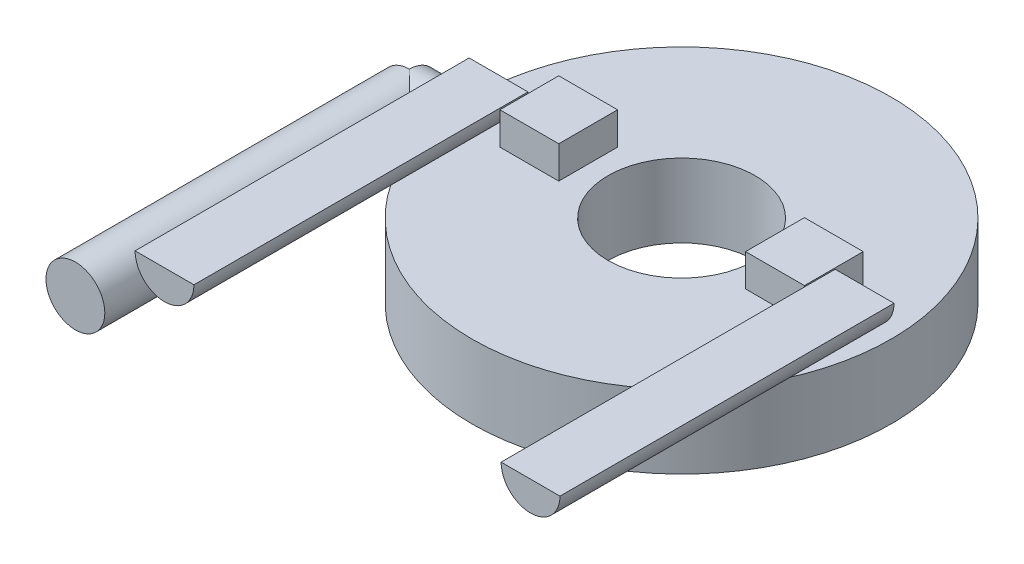
ISO-10303-21;
HEADER;
FILE_DESCRIPTION(('STEP AP214'),'2;1');
FILE_NAME('part.step','',(''),(''),'','','');
FILE_SCHEMA(('AUTOMOTIVE_DESIGN { 1 0 10303 214 1 1 1 1 }'));
ENDSEC;
DATA;
#1=APPLICATION_CONTEXT('core data for automotive mechanical design processes');
#2=APPLICATION_PROTOCOL_DEFINITION('international standard','automotive_design',2000,#1);
#3=PRODUCT_CONTEXT('',#1,'mechanical');
#4=PRODUCT('Part','Part','',(#3));
#5=PRODUCT_RELATED_PRODUCT_CATEGORY('part','',(#4));
#6=PRODUCT_DEFINITION_FORMATION('','',#4);
#7=PRODUCT_DEFINITION_CONTEXT('part definition',#1,'design');
#8=PRODUCT_DEFINITION('design','',#6,#7);
#9=PRODUCT_DEFINITION_SHAPE('','',#8);
#10=(LENGTH_UNIT() NAMED_UNIT(*) SI_UNIT(.MILLI.,.METRE.));
#11=(NAMED_UNIT(*) PLANE_ANGLE_UNIT() SI_UNIT($,.RADIAN.));
#12=(NAMED_UNIT(*) SI_UNIT($,.STERADIAN.) SOLID_ANGLE_UNIT());
#13=UNCERTAINTY_MEASURE_WITH_UNIT(LENGTH_MEASURE(1.E-05),#10,'distance_accuracy_value','');
#14=(GEOMETRIC_REPRESENTATION_CONTEXT(3) GLOBAL_UNCERTAINTY_ASSIGNED_CONTEXT((#13)) GLOBAL_UNIT_ASSIGNED_CONTEXT((#10,
#11,#12)) REPRESENTATION_CONTEXT('',''));
#15=CARTESIAN_POINT('',(0.,0.,0.));
#16=DIRECTION('',(0.,0.,1.));
#17=DIRECTION('',(1.,0.,0.));
#18=AXIS2_PLACEMENT_3D('',#15,#16,#17);
#19=CARTESIAN_POINT('',(-18.5,2.51700154936284,60.));
#20=DIRECTION('',(0.,0.,-1.));
#21=DIRECTION('',(-1.,0.,0.));
#22=AXIS2_PLACEMENT_3D('',#19,#20,#21);
#23=CYLINDRICAL_SURFACE('',#22,2.);
#24=CARTESIAN_POINT('',(-18.5,2.51700154936284,0.));
#25=DIRECTION('',(0.707106781186547,0.,-0.707106781186547));
#26=DIRECTION('',(0.707106781186547,0.,0.707106781186547));
#27=AXIS2_PLACEMENT_3D('',#24,#25,#26);
#28=ELLIPSE('',#27,2.82842712474619,2.);
#29=CARTESIAN_POINT('',(-18.5,4.51700154936283,0.));
#30=VERTEX_POINT('',#29);
#31=CARTESIAN_POINT('',(-18.5,0.517001549362833,0.));
#32=VERTEX_POINT('',#31);
#33=EDGE_CURVE('E63',#30,#32,#28,.T.);
#34=ORIENTED_EDGE('',*,*,#33,.F.);
#35=CARTESIAN_POINT('',(-18.5,2.51700154936284,0.));
#36=DIRECTION('',(0.,0.,1.));
#37=DIRECTION('',(1.,0.,0.));
#38=AXIS2_PLACEMENT_3D('',#35,#36,#37);
#39=CIRCLE('',#38,2.);
#40=EDGE_CURVE('E67',#30,#32,#39,.T.);
#41=ORIENTED_EDGE('',*,*,#40,.T.);
#42=EDGE_LOOP('',(#34,#41));
#43=FACE_BOUND('',#42,.T.);
#44=CARTESIAN_POINT('',(-18.5,2.51700154936284,22.71));
#45=DIRECTION('',(0.,0.,1.));
#46=DIRECTION('',(1.,0.,0.));
#47=AXIS2_PLACEMENT_3D('',#44,#45,#46);
#48=CIRCLE('',#47,2.);
#49=CARTESIAN_POINT('',(-16.5,2.51700154936284,22.71));
#50=VERTEX_POINT('',#49);
#51=EDGE_CURVE('E46',#50,#50,#48,.T.);
#52=ORIENTED_EDGE('',*,*,#51,.F.);
#53=EDGE_LOOP('',(#52));
#54=FACE_BOUND('',#53,.T.);
#55=ADVANCED_FACE('F42',(#43,#54),#23,.T.);
#56=CARTESIAN_POINT('',(-18.5,2.51700154936284,0.));
#57=DIRECTION('',(1.,0.,0.));
#58=DIRECTION('',(0.,0.,-1.));
#59=AXIS2_PLACEMENT_3D('',#56,#57,#58);
#60=CYLINDRICAL_SURFACE('',#59,2.);
#61=CARTESIAN_POINT('',(-14.5,2.51700154936284,0.));
#62=DIRECTION('',(1.,0.,0.));
#63=DIRECTION('',(0.,0.,-1.));
#64=AXIS2_PLACEMENT_3D('',#61,#62,#63);
#65=CIRCLE('',#64,2.);
#66=CARTESIAN_POINT('',(-14.5,2.51700154936284,-2.));
#67=VERTEX_POINT('',#66);
#68=EDGE_CURVE('E61',#67,#67,#65,.T.);
#69=ORIENTED_EDGE('',*,*,#68,.F.);
#70=EDGE_LOOP('',(#69));
#71=FACE_BOUND('',#70,.T.);
#72=CARTESIAN_POINT('',(-18.5,2.51700154936284,0.));
#73=DIRECTION('',(1.,0.,0.));
#74=DIRECTION('',(0.,0.,-1.));
#75=AXIS2_PLACEMENT_3D('',#72,#73,#74);
#76=CIRCLE('',#75,2.);
#77=EDGE_CURVE('E51',#32,#30,#76,.T.);
#78=ORIENTED_EDGE('',*,*,#77,.T.);
#79=ORIENTED_EDGE('',*,*,#33,.T.);
#80=EDGE_LOOP('',(#78,#79));
#81=FACE_BOUND('',#80,.T.);
#82=ADVANCED_FACE('F44',(#71,#81),#60,.T.);
#83=CARTESIAN_POINT('',(-18.5,2.51700154936284,0.));
#84=DIRECTION('',(1.,0.,0.));
#85=DIRECTION('',(0.,0.,-1.));
#86=AXIS2_PLACEMENT_3D('',#83,#84,#85);
#87=PLANE('',#86);
#88=DIRECTION('',(0.,-1.,0.));
#89=VECTOR('',#88,1.);
#90=CARTESIAN_POINT('',(-18.5,2.51700154936284,0.));
#91=LINE('',#90,#89);
#92=EDGE_CURVE('E12',#30,#32,#91,.T.);
#93=ORIENTED_EDGE('',*,*,#92,.F.);
#94=ORIENTED_EDGE('',*,*,#77,.F.);
#95=EDGE_LOOP('',(#93,#94));
#96=FACE_BOUND('',#95,.T.);
#97=ADVANCED_FACE('F58',(#96),#87,.F.);
#98=CARTESIAN_POINT('',(-14.5,2.51700154936284,0.));
#99=DIRECTION('',(1.,0.,0.));
#100=DIRECTION('',(0.,0.,-1.));
#101=AXIS2_PLACEMENT_3D('',#98,#99,#100);
#102=PLANE('',#101);
#103=ORIENTED_EDGE('',*,*,#68,.T.);
#104=EDGE_LOOP('',(#103));
#105=FACE_BOUND('',#104,.T.);
#106=ADVANCED_FACE('F78',(#105),#102,.T.);
#107=CARTESIAN_POINT('',(-18.5,2.51700154936284,0.));
#108=DIRECTION('',(0.,0.,1.));
#109=DIRECTION('',(1.,0.,0.));
#110=AXIS2_PLACEMENT_3D('',#107,#108,#109);
#111=PLANE('',#110);
#112=ORIENTED_EDGE('',*,*,#40,.F.);
#113=ORIENTED_EDGE('',*,*,#92,.T.);
#114=EDGE_LOOP('',(#112,#113));
#115=FACE_BOUND('',#114,.T.);
#116=ADVANCED_FACE('F70',(#115),#111,.F.);
#117=CARTESIAN_POINT('',(0.,0.,22.71));
#118=DIRECTION('',(0.,0.,1.));
#119=DIRECTION('',(1.,0.,0.));
#120=AXIS2_PLACEMENT_3D('',#117,#118,#119);
#121=PLANE('',#120);
#122=ORIENTED_EDGE('',*,*,#51,.T.);
#123=EDGE_LOOP('',(#122));
#124=FACE_BOUND('',#123,.T.);
#125=ADVANCED_FACE('F95',(#124),#121,.T.);
#126=CLOSED_SHELL('',(#55,#82,#97,#106,#116,#125));
#127=MANIFOLD_SOLID_BREP('B2',#126);
#128=CARTESIAN_POINT('',(-12.4416223380996,7.20558990758905,50.));
#129=DIRECTION('',(0.,0.,-1.));
#130=DIRECTION('',(-1.,0.,0.));
#131=AXIS2_PLACEMENT_3D('',#128,#129,#130);
#132=CYLINDRICAL_SURFACE('',#131,2.);
#133=DIRECTION('',(0.,0.,-1.));
#134=VECTOR('',#133,1.);
#135=CARTESIAN_POINT('',(-10.4416223380996,7.20558990758905,50.));
#136=LINE('',#135,#134);
#137=CARTESIAN_POINT('',(-10.4416223380996,7.20558990758905,0.));
#138=VERTEX_POINT('',#137);
#139=CARTESIAN_POINT('',(-10.4416223380996,7.20558990758905,22.71));
#140=VERTEX_POINT('',#139);
#141=EDGE_CURVE('E269',#138,#140,#136,.F.);
#142=ORIENTED_EDGE('',*,*,#141,.T.);
#143=CARTESIAN_POINT('',(-12.4416223380996,7.20558990758905,22.71));
#144=DIRECTION('',(0.,0.,1.));
#145=DIRECTION('',(1.,0.,0.));
#146=AXIS2_PLACEMENT_3D('',#143,#144,#145);
#147=CIRCLE('',#146,2.);
#148=CARTESIAN_POINT('',(-14.4416223380996,7.20558990758905,22.71));
#149=VERTEX_POINT('',#148);
#150=EDGE_CURVE('E271',#149,#140,#147,.T.);
#151=ORIENTED_EDGE('',*,*,#150,.F.);
#152=DIRECTION('',(0.,0.,-1.));
#153=VECTOR('',#152,1.);
#154=CARTESIAN_POINT('',(-14.4416223380996,7.20558990758905,10.8));
#155=LINE('',#154,#153);
#156=CARTESIAN_POINT('',(-14.4416223380996,7.20558990758905,0.));
#157=VERTEX_POINT('',#156);
#158=EDGE_CURVE('E154',#149,#157,#155,.T.);
#159=ORIENTED_EDGE('',*,*,#158,.T.);
#160=CARTESIAN_POINT('',(-12.4416223380996,7.20558990758905,0.));
#161=DIRECTION('',(0.,0.,1.));
#162=DIRECTION('',(1.,0.,0.));
#163=AXIS2_PLACEMENT_3D('',#160,#161,#162);
#164=CIRCLE('',#163,2.);
#165=CARTESIAN_POINT('',(-12.35,5.20768967305251,0.));
#166=VERTEX_POINT('',#165);
#167=EDGE_CURVE('E307',#157,#166,#164,.T.);
#168=ORIENTED_EDGE('',*,*,#167,.T.);
#169=DIRECTION('',(0.,0.,-1.));
#170=VECTOR('',#169,1.);
#171=CARTESIAN_POINT('',(-12.35,5.20768967305251,50.));
#172=LINE('',#171,#170);
#173=CARTESIAN_POINT('',(-12.35,5.20768967305251,0.444890075520965));
#174=VERTEX_POINT('',#173);
#175=EDGE_CURVE('E365',#174,#166,#172,.T.);
#176=ORIENTED_EDGE('',*,*,#175,.F.);
#177=CARTESIAN_POINT('',(-13.35,5.42377902442544,0.499853439076005));
#178=CARTESIAN_POINT('',(-13.3022227375615,5.39941908399942,0.49922432109884));
#179=CARTESIAN_POINT('',(-13.253536016312,5.37702197963531,0.496943120381653));
#180=CARTESIAN_POINT('',(-13.154664883016,5.33625187083389,0.490416670669622));
#181=CARTESIAN_POINT('',(-13.1044815582617,5.31787602213332,0.486172816531611));
#182=CARTESIAN_POINT('',(-13.0028456909245,5.28520428581433,0.477054322769225));
#183=CARTESIAN_POINT('',(-12.9513925567349,5.27091034049418,0.472179384453152));
#184=CARTESIAN_POINT('',(-12.8474546699708,5.24647030556812,0.462919047199399));
#185=CARTESIAN_POINT('',(-12.7949697792993,5.23632477522972,0.458533714325644));
#186=CARTESIAN_POINT('',(-12.6880727005762,5.22008020773417,0.451121724972281));
#187=CARTESIAN_POINT('',(-12.6336436150582,5.21407624533066,0.44812747613926));
#188=CARTESIAN_POINT('',(-12.5244029417248,5.20655424340447,0.444326597815746));
#189=CARTESIAN_POINT('',(-12.4695914174616,5.20503547554412,0.443519613143552));
#190=CARTESIAN_POINT('',(-12.3600887653573,5.20650299990815,0.444279970039959));
#191=CARTESIAN_POINT('',(-12.3053975775011,5.20948584800943,0.445845496437513));
#192=CARTESIAN_POINT('',(-12.1965391312583,5.21990991549709,0.450985672569335));
#193=CARTESIAN_POINT('',(-12.1423719220121,5.22735154900027,0.454560508919558));
#194=CARTESIAN_POINT('',(-12.0381933730756,5.24603033208506,0.462657259118758));
#195=CARTESIAN_POINT('',(-11.9881295789476,5.25700923278955,0.46710838386878));
#196=CARTESIAN_POINT('',(-11.8890053635826,5.28276990513428,0.476174660586184));
#197=CARTESIAN_POINT('',(-11.839944943457,5.29755168098631,0.480789812735226));
#198=CARTESIAN_POINT('',(-11.7431011570232,5.33084031707318,0.489142019735959));
#199=CARTESIAN_POINT('',(-11.6953160562097,5.34934179155828,0.492880327406584));
#200=CARTESIAN_POINT('',(-11.60123234373,5.38999993737917,0.498312432016284));
#201=CARTESIAN_POINT('',(-11.5549325554849,5.41215362573242,0.500007888162025));
#202=CARTESIAN_POINT('',(-11.4655194157922,5.45925137172054,0.499992286887384));
#203=CARTESIAN_POINT('',(-11.4223520984308,5.48409134464781,0.498382247957061));
#204=CARTESIAN_POINT('',(-11.3382640957877,5.53674212644939,0.490445192624991));
#205=CARTESIAN_POINT('',(-11.2973427233467,5.56455201890269,0.484119627699511));
#206=CARTESIAN_POINT('',(-11.2244280737912,5.61808445902195,0.466344173082147));
#207=CARTESIAN_POINT('',(-11.1920076809966,5.64351085882813,0.455786589451651));
#208=CARTESIAN_POINT('',(-11.1302913401187,5.69495722206262,0.428629456674195));
#209=CARTESIAN_POINT('',(-11.1009890694225,5.72097584928303,0.412042447281595));
#210=CARTESIAN_POINT('',(-11.0550087722601,5.76407176065748,0.377887405182587));
#211=CARTESIAN_POINT('',(-11.0372190368412,5.7814388946127,0.362188475234846));
#212=CARTESIAN_POINT('',(-11.004163065362,5.81481336926991,0.327103651047508));
#213=CARTESIAN_POINT('',(-10.9888937021851,5.8308223828635,0.307722390852944));
#214=CARTESIAN_POINT('',(-10.96354838673,5.85815145049087,0.268638772362519));
#215=CARTESIAN_POINT('',(-10.9530336107693,5.86981320178889,0.249461912847227));
#216=CARTESIAN_POINT('',(-10.934464272123,5.89080041903802,0.208746320425953));
#217=CARTESIAN_POINT('',(-10.92641032281,5.90012530240987,0.187207000480775));
#218=CARTESIAN_POINT('',(-10.9129945918835,5.91585904373531,0.142120989384022));
#219=CARTESIAN_POINT('',(-10.9076505855601,5.92224862313366,0.118562199945449));
#220=CARTESIAN_POINT('',(-10.8999422840021,5.93151727322928,0.0703335705013177));
#221=CARTESIAN_POINT('',(-10.8975697502136,5.93440604935123,0.045666999712504));
#222=CARTESIAN_POINT('',(-10.896475207016,5.93573988299013,0.0139428975974818));
#223=CARTESIAN_POINT('',(-10.8963550660946,5.93588648276425,0.00696956200464483));
#224=CARTESIAN_POINT('',(-10.8963560654743,5.93588437216481,0.));
#225=B_SPLINE_CURVE_WITH_KNOTS('',3,(#177,#178,#179,#180,#181,#182,#183,#184,#185,#186,#187,
#188,#189,#190,#191,#192,#193,#194,#195,#196,#197,#198,#199,#200,#201,#202,#203,#204,#205,#206,
#207,#208,#209,#210,#211,#212,#213,#214,#215,#216,#217,#218,#219,#220,#221,#222,#223,#224),
.UNSPECIFIED.,.F.,.F.,(4,2,2,2,2,2,2,2,2,2,2,2,2,2,2,2,2,2,2,2,2,2,2,4),(0.,0.160745012759061,
0.321375959262367,0.482083212157218,0.642812123621308,0.807117882585394,0.971396958948739,
1.13555041140231,1.29971911223314,1.45390731795378,1.60809569444365,1.76206240894502,
1.91590398700262,2.06511407078663,2.21427824547855,2.34146529888955,2.46838933325989,
2.55629520820845,2.64409118170232,2.71813944153929,2.79220614322411,2.86675258141089,
2.94109187506719,2.96200853306128),.UNSPECIFIED.);
#226=CARTESIAN_POINT('',(-10.8963560654743,5.93588437216481,0.));
#227=VERTEX_POINT('',#226);
#228=EDGE_CURVE('E333',#174,#227,#225,.T.);
#229=ORIENTED_EDGE('',*,*,#228,.T.);
#230=EDGE_CURVE('E273',#227,#138,#164,.T.);
#231=ORIENTED_EDGE('',*,*,#230,.T.);
#232=EDGE_LOOP('',(#142,#151,#159,#168,#176,#229,#231));
#233=FACE_BOUND('',#232,.T.);
#234=ADVANCED_FACE('F131',(#233),#132,.T.);
#235=CARTESIAN_POINT('',(12.4416223380996,7.20558990758905,50.));
#236=DIRECTION('',(0.,0.,-1.));
#237=DIRECTION('',(-1.,0.,0.));
#238=AXIS2_PLACEMENT_3D('',#235,#236,#237);
#239=CYLINDRICAL_SURFACE('',#238,2.);
#240=DIRECTION('',(0.,0.,-1.));
#241=VECTOR('',#240,1.);
#242=CARTESIAN_POINT('',(14.4416223380996,7.20558990758905,50.));
#243=LINE('',#242,#241);
#244=CARTESIAN_POINT('',(14.4416223380996,7.20558990758905,0.));
#245=VERTEX_POINT('',#244);
#246=CARTESIAN_POINT('',(14.4416223380996,7.20558990758905,22.71));
#247=VERTEX_POINT('',#246);
#248=EDGE_CURVE('E289',#245,#247,#243,.F.);
#249=ORIENTED_EDGE('',*,*,#248,.T.);
#250=CARTESIAN_POINT('',(12.4416223380996,7.20558990758905,22.71));
#251=DIRECTION('',(0.,0.,1.));
#252=DIRECTION('',(1.,0.,0.));
#253=AXIS2_PLACEMENT_3D('',#250,#251,#252);
#254=CIRCLE('',#253,2.);
#255=CARTESIAN_POINT('',(10.4416223380996,7.20558990758905,22.71));
#256=VERTEX_POINT('',#255);
#257=EDGE_CURVE('E281',#256,#247,#254,.T.);
#258=ORIENTED_EDGE('',*,*,#257,.F.);
#259=DIRECTION('',(0.,0.,-1.));
#260=VECTOR('',#259,1.);
#261=CARTESIAN_POINT('',(10.4416223380996,7.20558990758905,50.));
#262=LINE('',#261,#260);
#263=CARTESIAN_POINT('',(10.4416223380996,7.20558990758905,0.));
#264=VERTEX_POINT('',#263);
#265=EDGE_CURVE('E146',#256,#264,#262,.T.);
#266=ORIENTED_EDGE('',*,*,#265,.T.);
#267=CARTESIAN_POINT('',(12.4416223380996,7.20558990758905,0.));
#268=DIRECTION('',(0.,0.,1.));
#269=DIRECTION('',(-1.,0.,0.));
#270=AXIS2_PLACEMENT_3D('',#267,#268,#269);
#271=CIRCLE('',#270,2.);
#272=CARTESIAN_POINT('',(10.8647563682638,5.97534858444386,0.));
#273=VERTEX_POINT('',#272);
#274=EDGE_CURVE('E275',#264,#273,#271,.T.);
#275=ORIENTED_EDGE('',*,*,#274,.T.);
#276=CARTESIAN_POINT('',(10.8647563682638,5.97534858444386,0.));
#277=CARTESIAN_POINT('',(10.8647436619068,5.97538452216022,0.0233629965832708));
#278=CARTESIAN_POINT('',(10.8660320523148,5.97371343173734,0.0466998410226324));
#279=CARTESIAN_POINT('',(10.8711059737543,5.96724112451889,0.092549610755516));
#280=CARTESIAN_POINT('',(10.8748799153355,5.96245443611927,0.11506585054206));
#281=CARTESIAN_POINT('',(10.8848178344286,5.95003480100776,0.158715108038682));
#282=CARTESIAN_POINT('',(10.8909800262773,5.94240398097848,0.179849145437625));
#283=CARTESIAN_POINT('',(10.9055273798951,5.92475283380514,0.220277980942466));
#284=CARTESIAN_POINT('',(10.9139141615806,5.91473076592296,0.23957142477621));
#285=CARTESIAN_POINT('',(10.9331228181835,5.89232863673864,0.276805055100408));
#286=CARTESIAN_POINT('',(10.9440373105059,5.87986274184013,0.294645236353164));
#287=CARTESIAN_POINT('',(10.9677918260765,5.85350272342556,0.327793787644266));
#288=CARTESIAN_POINT('',(10.9806327493825,5.83960793326748,0.343100967157946));
#289=CARTESIAN_POINT('',(11.0146051073453,5.80399098075733,0.377996366723722));
#290=CARTESIAN_POINT('',(11.0367402064246,5.78173650304027,0.396068573323183));
#291=CARTESIAN_POINT('',(11.0838706990195,5.73671887216411,0.427126806106922));
#292=CARTESIAN_POINT('',(11.1088722080429,5.71395471805057,0.440101686074611));
#293=CARTESIAN_POINT('',(11.1734590139283,5.65822735343677,0.466811841903118));
#294=CARTESIAN_POINT('',(11.2143365100606,5.62554843897496,0.47798825598425));
#295=CARTESIAN_POINT('',(11.2993762679809,5.56300532486035,0.493312032907122));
#296=CARTESIAN_POINT('',(11.343544695028,5.53314665857606,0.497445837968358));
#297=CARTESIAN_POINT('',(11.4269852502421,5.48148960354669,0.500518431533074));
#298=CARTESIAN_POINT('',(11.4659147670283,5.45916519896537,0.50018062439717));
#299=CARTESIAN_POINT('',(11.5451155682731,5.41721427307223,0.497053992058696));
#300=CARTESIAN_POINT('',(11.5853877790273,5.39758966422398,0.494263439630842));
#301=CARTESIAN_POINT('',(11.7080605673917,5.34281928262653,0.483556296475689));
#302=CARTESIAN_POINT('',(11.7921686771051,5.31186867595082,0.473306014787365));
#303=CARTESIAN_POINT('',(11.9245660945922,5.27296829576099,0.457448462014196));
#304=CARTESIAN_POINT('',(11.9717347792904,5.26096141536058,0.451851341064138));
#305=CARTESIAN_POINT('',(12.0669075907281,5.24040421650922,0.441513740770108));
#306=CARTESIAN_POINT('',(12.1149112885606,5.231852175145,0.436772835089176));
#307=CARTESIAN_POINT('',(12.2114014504997,5.21828903393436,0.428931345540276));
#308=CARTESIAN_POINT('',(12.2598859758326,5.21326712493268,0.425825761760428));
#309=CARTESIAN_POINT('',(12.3571801566665,5.20677889354485,0.421764561714913));
#310=CARTESIAN_POINT('',(12.4059897596434,5.20531201009509,0.420808606190907));
#311=CARTESIAN_POINT('',(12.506929608347,5.20597648225507,0.421235543835874));
#312=CARTESIAN_POINT('',(12.5590576594614,5.20836191137901,0.422783596035681));
#313=CARTESIAN_POINT('',(12.6628546733254,5.21718066246105,0.428223249185412));
#314=CARTESIAN_POINT('',(12.7145234750495,5.223615351502,0.432115641596049));
#315=CARTESIAN_POINT('',(12.8171738370339,5.24047576467368,0.441505870790745));
#316=CARTESIAN_POINT('',(12.8681534988286,5.250910824139,0.447007455642647));
#317=CARTESIAN_POINT('',(12.9690836952379,5.27569716441933,0.458612976744573));
#318=CARTESIAN_POINT('',(13.0190340774836,5.29004902063917,0.464717001413047));
#319=CARTESIAN_POINT('',(13.1167088929789,5.3222823886099,0.476297703034743));
#320=CARTESIAN_POINT('',(13.1644579933117,5.34008486252085,0.481784734600656));
#321=CARTESIAN_POINT('',(13.2583953025113,5.37926541408505,0.491086618214521));
#322=CARTESIAN_POINT('',(13.3045890969867,5.40062856871847,0.494908218125931));
#323=CARTESIAN_POINT('',(13.35,5.42377902442544,0.497333470097788));
#324=B_SPLINE_CURVE_WITH_KNOTS('',3,(#276,#277,#278,#279,#280,#281,#282,#283,#284,#285,#286,
#287,#288,#289,#290,#291,#292,#293,#294,#295,#296,#297,#298,#299,#300,#301,#302,#303,#304,#305,
#306,#307,#308,#309,#310,#311,#312,#313,#314,#315,#316,#317,#318,#319,#320,#321,#322,#323),
.UNSPECIFIED.,.F.,.F.,(4,2,2,2,2,2,2,2,2,2,2,2,2,2,2,2,2,2,2,2,2,2,2,4),(0.,0.0699528171203608,
0.139581750743532,0.209158723855591,0.278786501743177,0.351548418225632,0.424344436665846,
0.532389188706951,0.640668902130536,0.800312080051409,0.960262242443975,1.09470182892292,
1.22923616378957,1.4988232258405,1.64571047114324,1.79252437371661,1.93888675514894,
2.08522603577565,2.24161694770723,2.39806068759358,2.55487175182359,2.71170586510744,
2.86530019367024,3.01826628019723),.UNSPECIFIED.);
#325=CARTESIAN_POINT('',(12.35,5.20768967305251,0.422325356985345));
#326=VERTEX_POINT('',#325);
#327=EDGE_CURVE('E298',#273,#326,#324,.T.);
#328=ORIENTED_EDGE('',*,*,#327,.T.);
#329=DIRECTION('',(0.,0.,-1.));
#330=VECTOR('',#329,1.);
#331=CARTESIAN_POINT('',(12.35,5.20768967305251,50.));
#332=LINE('',#331,#330);
#333=CARTESIAN_POINT('',(12.35,5.20768967305251,0.));
#334=VERTEX_POINT('',#333);
#335=EDGE_CURVE('E357',#334,#326,#332,.F.);
#336=ORIENTED_EDGE('',*,*,#335,.F.);
#337=EDGE_CURVE('E292',#334,#245,#271,.T.);
#338=ORIENTED_EDGE('',*,*,#337,.T.);
#339=EDGE_LOOP('',(#249,#258,#266,#275,#328,#336,#338));
#340=FACE_BOUND('',#339,.T.);
#341=ADVANCED_FACE('F313',(#340),#239,.T.);
#342=CARTESIAN_POINT('',(0.,0.,22.71));
#343=DIRECTION('',(0.,0.,1.));
#344=DIRECTION('',(1.,0.,0.));
#345=AXIS2_PLACEMENT_3D('',#342,#343,#344);
#346=PLANE('',#345);
#347=ORIENTED_EDGE('',*,*,#257,.T.);
#348=DIRECTION('',(-1.,0.,0.));
#349=VECTOR('',#348,1.);
#350=CARTESIAN_POINT('',(0.,7.20558990758905,22.71));
#351=LINE('',#350,#349);
#352=EDGE_CURVE('E285',#247,#256,#351,.T.);
#353=ORIENTED_EDGE('',*,*,#352,.T.);
#354=EDGE_LOOP('',(#347,#353));
#355=FACE_BOUND('',#354,.T.);
#356=ADVANCED_FACE('F318',(#355),#346,.T.);
#357=ORIENTED_EDGE('',*,*,#150,.T.);
#358=DIRECTION('',(-1.,0.,0.));
#359=VECTOR('',#358,1.);
#360=CARTESIAN_POINT('',(0.,7.20558990758905,22.71));
#361=LINE('',#360,#359);
#362=EDGE_CURVE('E40',#140,#149,#361,.T.);
#363=ORIENTED_EDGE('',*,*,#362,.T.);
#364=EDGE_LOOP('',(#357,#363));
#365=FACE_BOUND('',#364,.T.);
#366=ADVANCED_FACE('F279',(#365),#346,.T.);
#367=CARTESIAN_POINT('',(12.35,5.47534858444386,0.));
#368=DIRECTION('',(-1.,0.,0.));
#369=DIRECTION('',(0.,0.,1.));
#370=AXIS2_PLACEMENT_3D('',#367,#368,#369);
#371=CYLINDRICAL_SURFACE('',#370,0.5);
#372=ORIENTED_EDGE('',*,*,#327,.F.);
#373=DIRECTION('',(-1.,0.,0.));
#374=VECTOR('',#373,1.);
#375=CARTESIAN_POINT('',(12.35,5.97534858444386,0.));
#376=LINE('',#375,#374);
#377=CARTESIAN_POINT('',(12.35,5.97534858444386,0.));
#378=VERTEX_POINT('',#377);
#379=EDGE_CURVE('E295',#273,#378,#376,.F.);
#380=ORIENTED_EDGE('',*,*,#379,.T.);
#381=CARTESIAN_POINT('',(12.35,5.47534858444386,0.));
#382=DIRECTION('',(1.,0.,0.));
#383=DIRECTION('',(0.,0.,-1.));
#384=AXIS2_PLACEMENT_3D('',#381,#382,#383);
#385=CIRCLE('',#384,0.5);
#386=CARTESIAN_POINT('',(12.35,5.,-0.155060385873446));
#387=VERTEX_POINT('',#386);
#388=EDGE_CURVE('E361',#387,#378,#385,.T.);
#389=ORIENTED_EDGE('',*,*,#388,.F.);
#390=DIRECTION('',(-1.,0.,0.));
#391=VECTOR('',#390,1.);
#392=CARTESIAN_POINT('',(12.35,5.,-0.155060385873446));
#393=LINE('',#392,#391);
#394=CARTESIAN_POINT('',(10.35,5.,-0.155060385873446));
#395=VERTEX_POINT('',#394);
#396=EDGE_CURVE('E454',#395,#387,#393,.F.);
#397=ORIENTED_EDGE('',*,*,#396,.F.);
#398=CARTESIAN_POINT('',(10.35,5.47534858444386,0.));
#399=DIRECTION('',(-1.,0.,0.));
#400=DIRECTION('',(0.,0.,1.));
#401=AXIS2_PLACEMENT_3D('',#398,#399,#400);
#402=CIRCLE('',#401,0.5);
#403=CARTESIAN_POINT('',(10.35,5.,0.155060385873446));
#404=VERTEX_POINT('',#403);
#405=EDGE_CURVE('E386',#395,#404,#402,.F.);
#406=ORIENTED_EDGE('',*,*,#405,.T.);
#407=DIRECTION('',(-1.,0.,0.));
#408=VECTOR('',#407,1.);
#409=CARTESIAN_POINT('',(12.35,5.,0.155060385873446));
#410=LINE('',#409,#408);
#411=CARTESIAN_POINT('',(12.35,5.,0.155060385873446));
#412=VERTEX_POINT('',#411);
#413=EDGE_CURVE('E463',#412,#404,#410,.T.);
#414=ORIENTED_EDGE('',*,*,#413,.F.);
#415=EDGE_CURVE('E467',#326,#412,#385,.T.);
#416=ORIENTED_EDGE('',*,*,#415,.F.);
#417=EDGE_LOOP('',(#372,#380,#389,#397,#406,#414,#416));
#418=FACE_BOUND('',#417,.T.);
#419=ADVANCED_FACE('F309',(#418),#371,.T.);
#420=CARTESIAN_POINT('',(12.35,5.47534858444386,0.));
#421=DIRECTION('',(1.,0.,0.));
#422=DIRECTION('',(0.,0.,-1.));
#423=AXIS2_PLACEMENT_3D('',#420,#421,#422);
#424=PLANE('',#423);
#425=DIRECTION('',(0.,1.,0.));
#426=VECTOR('',#425,1.);
#427=CARTESIAN_POINT('',(12.35,5.47534858444386,0.));
#428=LINE('',#427,#426);
#429=EDGE_CURVE('E355',#334,#378,#428,.T.);
#430=ORIENTED_EDGE('',*,*,#429,.F.);
#431=ORIENTED_EDGE('',*,*,#335,.T.);
#432=ORIENTED_EDGE('',*,*,#415,.T.);
#433=DIRECTION('',(0.,0.,-1.));
#434=VECTOR('',#433,1.);
#435=CARTESIAN_POINT('',(12.35,5.,0.));
#436=LINE('',#435,#434);
#437=EDGE_CURVE('E384',#412,#387,#436,.T.);
#438=ORIENTED_EDGE('',*,*,#437,.T.);
#439=ORIENTED_EDGE('',*,*,#388,.T.);
#440=EDGE_LOOP('',(#430,#431,#432,#438,#439));
#441=FACE_BOUND('',#440,.T.);
#442=ADVANCED_FACE('F346',(#441),#424,.T.);
#443=CARTESIAN_POINT('',(-12.35,5.43588437216481,0.));
#444=DIRECTION('',(1.,0.,0.));
#445=DIRECTION('',(0.,0.,-1.));
#446=AXIS2_PLACEMENT_3D('',#443,#444,#445);
#447=CYLINDRICAL_SURFACE('',#446,0.5);
#448=ORIENTED_EDGE('',*,*,#228,.F.);
#449=CARTESIAN_POINT('',(-12.35,5.43588437216481,0.));
#450=DIRECTION('',(-1.,0.,0.));
#451=DIRECTION('',(0.,0.,1.));
#452=AXIS2_PLACEMENT_3D('',#449,#450,#451);
#453=CIRCLE('',#452,0.5);
#454=CARTESIAN_POINT('',(-12.35,5.,0.244958800826779));
#455=VERTEX_POINT('',#454);
#456=EDGE_CURVE('E341',#455,#174,#453,.T.);
#457=ORIENTED_EDGE('',*,*,#456,.F.);
#458=DIRECTION('',(1.,0.,0.));
#459=VECTOR('',#458,1.);
#460=CARTESIAN_POINT('',(-12.35,5.,0.244958800826779));
#461=LINE('',#460,#459);
#462=CARTESIAN_POINT('',(-10.35,5.,0.244958800826779));
#463=VERTEX_POINT('',#462);
#464=EDGE_CURVE('E468',#463,#455,#461,.F.);
#465=ORIENTED_EDGE('',*,*,#464,.F.);
#466=CARTESIAN_POINT('',(-10.35,5.43588437216481,0.));
#467=DIRECTION('',(1.,0.,0.));
#468=DIRECTION('',(0.,0.,-1.));
#469=AXIS2_PLACEMENT_3D('',#466,#467,#468);
#470=CIRCLE('',#469,0.5);
#471=CARTESIAN_POINT('',(-10.35,5.,-0.244958800826779));
#472=VERTEX_POINT('',#471);
#473=EDGE_CURVE('E381',#463,#472,#470,.F.);
#474=ORIENTED_EDGE('',*,*,#473,.T.);
#475=DIRECTION('',(1.,0.,0.));
#476=VECTOR('',#475,1.);
#477=CARTESIAN_POINT('',(-12.35,5.,-0.244958800826779));
#478=LINE('',#477,#476);
#479=CARTESIAN_POINT('',(-12.35,5.,-0.244958800826779));
#480=VERTEX_POINT('',#479);
#481=EDGE_CURVE('E469',#480,#472,#478,.T.);
#482=ORIENTED_EDGE('',*,*,#481,.F.);
#483=CARTESIAN_POINT('',(-12.35,5.93588437216481,0.));
#484=VERTEX_POINT('',#483);
#485=EDGE_CURVE('E339',#484,#480,#453,.T.);
#486=ORIENTED_EDGE('',*,*,#485,.F.);
#487=DIRECTION('',(1.,0.,0.));
#488=VECTOR('',#487,1.);
#489=CARTESIAN_POINT('',(-12.35,5.93588437216481,0.));
#490=LINE('',#489,#488);
#491=EDGE_CURVE('E340',#227,#484,#490,.F.);
#492=ORIENTED_EDGE('',*,*,#491,.F.);
#493=EDGE_LOOP('',(#448,#457,#465,#474,#482,#486,#492));
#494=FACE_BOUND('',#493,.T.);
#495=ADVANCED_FACE('F343',(#494),#447,.T.);
#496=CARTESIAN_POINT('',(-12.35,5.43588437216481,0.));
#497=DIRECTION('',(-1.,0.,0.));
#498=DIRECTION('',(0.,0.,1.));
#499=AXIS2_PLACEMENT_3D('',#496,#497,#498);
#500=PLANE('',#499);
#501=ORIENTED_EDGE('',*,*,#456,.T.);
#502=ORIENTED_EDGE('',*,*,#175,.T.);
#503=DIRECTION('',(0.,1.,0.));
#504=VECTOR('',#503,1.);
#505=CARTESIAN_POINT('',(-12.35,5.43588437216481,0.));
#506=LINE('',#505,#504);
#507=EDGE_CURVE('E375',#166,#484,#506,.T.);
#508=ORIENTED_EDGE('',*,*,#507,.T.);
#509=ORIENTED_EDGE('',*,*,#485,.T.);
#510=DIRECTION('',(0.,0.,1.));
#511=VECTOR('',#510,1.);
#512=CARTESIAN_POINT('',(-12.35,5.,0.));
#513=LINE('',#512,#511);
#514=EDGE_CURVE('E378',#480,#455,#513,.T.);
#515=ORIENTED_EDGE('',*,*,#514,.T.);
#516=EDGE_LOOP('',(#501,#502,#508,#509,#515));
#517=FACE_BOUND('',#516,.T.);
#518=ADVANCED_FACE('F330',(#517),#500,.T.);
#519=CARTESIAN_POINT('',(0.,5.,0.));
#520=DIRECTION('',(0.,1.,0.));
#521=DIRECTION('',(0.,0.,1.));
#522=AXIS2_PLACEMENT_3D('',#519,#520,#521);
#523=PLANE('',#522);
#524=DIRECTION('',(0.,0.,-1.));
#525=VECTOR('',#524,1.);
#526=CARTESIAN_POINT('',(10.35,5.,-2.));
#527=LINE('',#526,#525);
#528=CARTESIAN_POINT('',(10.35,5.,-2.));
#529=VERTEX_POINT('',#528);
#530=EDGE_CURVE('E445',#395,#529,#527,.T.);
#531=ORIENTED_EDGE('',*,*,#530,.F.);
#532=ORIENTED_EDGE('',*,*,#396,.T.);
#533=ORIENTED_EDGE('',*,*,#437,.F.);
#534=ORIENTED_EDGE('',*,*,#413,.T.);
#535=CARTESIAN_POINT('',(10.35,5.,2.00000000000001));
#536=VERTEX_POINT('',#535);
#537=EDGE_CURVE('E442',#536,#404,#527,.T.);
#538=ORIENTED_EDGE('',*,*,#537,.F.);
#539=DIRECTION('',(1.,0.,0.));
#540=VECTOR('',#539,1.);
#541=CARTESIAN_POINT('',(10.35,5.,2.00000000000001));
#542=LINE('',#541,#540);
#543=CARTESIAN_POINT('',(6.35,5.,2.));
#544=VERTEX_POINT('',#543);
#545=EDGE_CURVE('E446',#544,#536,#542,.T.);
#546=ORIENTED_EDGE('',*,*,#545,.F.);
#547=DIRECTION('',(0.,0.,1.));
#548=VECTOR('',#547,1.);
#549=CARTESIAN_POINT('',(6.35,5.,-1.99999999999999));
#550=LINE('',#549,#548);
#551=CARTESIAN_POINT('',(6.35,5.,-1.99999999999999));
#552=VERTEX_POINT('',#551);
#553=EDGE_CURVE('E449',#552,#544,#550,.T.);
#554=ORIENTED_EDGE('',*,*,#553,.F.);
#555=DIRECTION('',(-1.,0.,0.));
#556=VECTOR('',#555,1.);
#557=CARTESIAN_POINT('',(10.35,5.,-2.));
#558=LINE('',#557,#556);
#559=EDGE_CURVE('E451',#529,#552,#558,.T.);
#560=ORIENTED_EDGE('',*,*,#559,.F.);
#561=EDGE_LOOP('',(#531,#532,#533,#534,#538,#546,#554,#560));
#562=FACE_BOUND('',#561,.T.);
#563=CARTESIAN_POINT('',(0.,5.,0.));
#564=DIRECTION('',(0.,1.,0.));
#565=DIRECTION('',(0.,0.,1.));
#566=AXIS2_PLACEMENT_3D('',#563,#564,#565);
#567=CIRCLE('',#566,14.25);
#568=CARTESIAN_POINT('',(0.,5.,14.25));
#569=VERTEX_POINT('',#568);
#570=EDGE_CURVE('E389',#569,#569,#567,.T.);
#571=ORIENTED_EDGE('',*,*,#570,.T.);
#572=EDGE_LOOP('',(#571));
#573=FACE_BOUND('',#572,.T.);
#574=CARTESIAN_POINT('',(0.,5.,0.));
#575=DIRECTION('',(0.,1.,0.));
#576=DIRECTION('',(0.,0.,1.));
#577=AXIS2_PLACEMENT_3D('',#574,#575,#576);
#578=CIRCLE('',#577,5.);
#579=CARTESIAN_POINT('',(0.,5.,5.));
#580=VERTEX_POINT('',#579);
#581=EDGE_CURVE('E393',#580,#580,#578,.T.);
#582=ORIENTED_EDGE('',*,*,#581,.F.);
#583=EDGE_LOOP('',(#582));
#584=FACE_BOUND('',#583,.T.);
#585=DIRECTION('',(0.,0.,1.));
#586=VECTOR('',#585,1.);
#587=CARTESIAN_POINT('',(-10.35,5.,-1.99999999999999));
#588=LINE('',#587,#586);
#589=CARTESIAN_POINT('',(-10.35,5.,2.00000000000001));
#590=VERTEX_POINT('',#589);
#591=EDGE_CURVE('E423',#463,#590,#588,.T.);
#592=ORIENTED_EDGE('',*,*,#591,.F.);
#593=ORIENTED_EDGE('',*,*,#464,.T.);
#594=ORIENTED_EDGE('',*,*,#514,.F.);
#595=ORIENTED_EDGE('',*,*,#481,.T.);
#596=CARTESIAN_POINT('',(-10.35,5.,-1.99999999999999));
#597=VERTEX_POINT('',#596);
#598=EDGE_CURVE('E421',#597,#472,#588,.T.);
#599=ORIENTED_EDGE('',*,*,#598,.F.);
#600=DIRECTION('',(-1.,0.,0.));
#601=VECTOR('',#600,1.);
#602=CARTESIAN_POINT('',(-10.35,5.,-1.99999999999999));
#603=LINE('',#602,#601);
#604=CARTESIAN_POINT('',(-6.34999999999999,5.,-1.99999999999999));
#605=VERTEX_POINT('',#604);
#606=EDGE_CURVE('E413',#605,#597,#603,.T.);
#607=ORIENTED_EDGE('',*,*,#606,.F.);
#608=DIRECTION('',(0.,0.,-1.));
#609=VECTOR('',#608,1.);
#610=CARTESIAN_POINT('',(-6.34999999999999,5.,-1.99999999999999));
#611=LINE('',#610,#609);
#612=CARTESIAN_POINT('',(-6.34999999999999,5.,2.00000000000001));
#613=VERTEX_POINT('',#612);
#614=EDGE_CURVE('E416',#613,#605,#611,.T.);
#615=ORIENTED_EDGE('',*,*,#614,.F.);
#616=DIRECTION('',(1.,0.,0.));
#617=VECTOR('',#616,1.);
#618=CARTESIAN_POINT('',(-10.35,5.,2.00000000000001));
#619=LINE('',#618,#617);
#620=EDGE_CURVE('E419',#590,#613,#619,.T.);
#621=ORIENTED_EDGE('',*,*,#620,.F.);
#622=EDGE_LOOP('',(#592,#593,#594,#595,#599,#607,#615,#621));
#623=FACE_BOUND('',#622,.T.);
#624=ADVANCED_FACE('F482',(#562,#573,#584,#623),#523,.T.);
#625=CARTESIAN_POINT('',(-10.35,7.2,-1.99999999999999));
#626=DIRECTION('',(1.,0.,0.));
#627=DIRECTION('',(0.,0.,-1.));
#628=AXIS2_PLACEMENT_3D('',#625,#626,#627);
#629=PLANE('',#628);
#630=ORIENTED_EDGE('',*,*,#473,.F.);
#631=ORIENTED_EDGE('',*,*,#591,.T.);
#632=DIRECTION('',(0.,-1.,0.));
#633=VECTOR('',#632,1.);
#634=CARTESIAN_POINT('',(-10.35,7.2,2.00000000000001));
#635=LINE('',#634,#633);
#636=CARTESIAN_POINT('',(-10.35,7.2,2.00000000000001));
#637=VERTEX_POINT('',#636);
#638=EDGE_CURVE('E399',#637,#590,#635,.T.);
#639=ORIENTED_EDGE('',*,*,#638,.F.);
#640=DIRECTION('',(0.,0.,1.));
#641=VECTOR('',#640,1.);
#642=CARTESIAN_POINT('',(-10.35,7.2,-1.99999999999999));
#643=LINE('',#642,#641);
#644=CARTESIAN_POINT('',(-10.35,7.2,-1.99999999999999));
#645=VERTEX_POINT('',#644);
#646=EDGE_CURVE('E415',#645,#637,#643,.T.);
#647=ORIENTED_EDGE('',*,*,#646,.F.);
#648=DIRECTION('',(0.,-1.,0.));
#649=VECTOR('',#648,1.);
#650=CARTESIAN_POINT('',(-10.35,7.2,-1.99999999999999));
#651=LINE('',#650,#649);
#652=EDGE_CURVE('E409',#645,#597,#651,.T.);
#653=ORIENTED_EDGE('',*,*,#652,.T.);
#654=ORIENTED_EDGE('',*,*,#598,.T.);
#655=EDGE_LOOP('',(#630,#631,#639,#647,#653,#654));
#656=FACE_BOUND('',#655,.T.);
#657=ADVANCED_FACE('F486',(#656),#629,.F.);
#658=CARTESIAN_POINT('',(10.35,7.2,-2.));
#659=DIRECTION('',(-1.,0.,0.));
#660=DIRECTION('',(0.,0.,1.));
#661=AXIS2_PLACEMENT_3D('',#658,#659,#660);
#662=PLANE('',#661);
#663=ORIENTED_EDGE('',*,*,#405,.F.);
#664=ORIENTED_EDGE('',*,*,#530,.T.);
#665=DIRECTION('',(0.,-1.,0.));
#666=VECTOR('',#665,1.);
#667=CARTESIAN_POINT('',(10.35,7.2,-2.));
#668=LINE('',#667,#666);
#669=CARTESIAN_POINT('',(10.35,7.2,-2.));
#670=VERTEX_POINT('',#669);
#671=EDGE_CURVE('E438',#670,#529,#668,.T.);
#672=ORIENTED_EDGE('',*,*,#671,.F.);
#673=DIRECTION('',(0.,0.,-1.));
#674=VECTOR('',#673,1.);
#675=CARTESIAN_POINT('',(10.35,7.2,-2.));
#676=LINE('',#675,#674);
#677=CARTESIAN_POINT('',(10.35,7.2,2.00000000000001));
#678=VERTEX_POINT('',#677);
#679=EDGE_CURVE('E441',#678,#670,#676,.T.);
#680=ORIENTED_EDGE('',*,*,#679,.F.);
#681=DIRECTION('',(0.,-1.,0.));
#682=VECTOR('',#681,1.);
#683=CARTESIAN_POINT('',(10.35,7.2,2.00000000000001));
#684=LINE('',#683,#682);
#685=EDGE_CURVE('E436',#678,#536,#684,.T.);
#686=ORIENTED_EDGE('',*,*,#685,.T.);
#687=ORIENTED_EDGE('',*,*,#537,.T.);
#688=EDGE_LOOP('',(#663,#664,#672,#680,#686,#687));
#689=FACE_BOUND('',#688,.T.);
#690=ADVANCED_FACE('F521',(#689),#662,.F.);
#691=CARTESIAN_POINT('',(0.,0.,0.));
#692=DIRECTION('',(0.,1.,0.));
#693=DIRECTION('',(0.,0.,1.));
#694=AXIS2_PLACEMENT_3D('',#691,#692,#693);
#695=PLANE('',#694);
#696=CARTESIAN_POINT('',(0.,0.,0.));
#697=DIRECTION('',(0.,1.,0.));
#698=DIRECTION('',(0.,0.,1.));
#699=AXIS2_PLACEMENT_3D('',#696,#697,#698);
#700=CIRCLE('',#699,14.25);
#701=CARTESIAN_POINT('',(0.,0.,14.25));
#702=VERTEX_POINT('',#701);
#703=EDGE_CURVE('E390',#702,#702,#700,.T.);
#704=ORIENTED_EDGE('',*,*,#703,.F.);
#705=EDGE_LOOP('',(#704));
#706=FACE_BOUND('',#705,.T.);
#707=CARTESIAN_POINT('',(0.,0.,0.));
#708=DIRECTION('',(0.,1.,0.));
#709=DIRECTION('',(0.,0.,1.));
#710=AXIS2_PLACEMENT_3D('',#707,#708,#709);
#711=CIRCLE('',#710,5.);
#712=CARTESIAN_POINT('',(0.,0.,5.));
#713=VERTEX_POINT('',#712);
#714=EDGE_CURVE('E396',#713,#713,#711,.T.);
#715=ORIENTED_EDGE('',*,*,#714,.T.);
#716=EDGE_LOOP('',(#715));
#717=FACE_BOUND('',#716,.T.);
#718=ADVANCED_FACE('F527',(#706,#717),#695,.F.);
#719=CARTESIAN_POINT('',(0.,5.,0.));
#720=DIRECTION('',(0.,-1.,0.));
#721=DIRECTION('',(0.,0.,-1.));
#722=AXIS2_PLACEMENT_3D('',#719,#720,#721);
#723=CYLINDRICAL_SURFACE('',#722,14.25);
#724=ORIENTED_EDGE('',*,*,#570,.F.);
#725=EDGE_LOOP('',(#724));
#726=FACE_BOUND('',#725,.T.);
#727=ORIENTED_EDGE('',*,*,#703,.T.);
#728=EDGE_LOOP('',(#727));
#729=FACE_BOUND('',#728,.T.);
#730=ADVANCED_FACE('F133',(#726,#729),#723,.T.);
#731=CARTESIAN_POINT('',(0.,5.,0.));
#732=DIRECTION('',(0.,-1.,0.));
#733=DIRECTION('',(0.,0.,-1.));
#734=AXIS2_PLACEMENT_3D('',#731,#732,#733);
#735=CYLINDRICAL_SURFACE('',#734,5.);
#736=ORIENTED_EDGE('',*,*,#581,.T.);
#737=EDGE_LOOP('',(#736));
#738=FACE_BOUND('',#737,.T.);
#739=ORIENTED_EDGE('',*,*,#714,.F.);
#740=EDGE_LOOP('',(#739));
#741=FACE_BOUND('',#740,.T.);
#742=ADVANCED_FACE('F518',(#738,#741),#735,.F.);
#743=CARTESIAN_POINT('',(-10.35,7.2,2.00000000000001));
#744=DIRECTION('',(0.,0.,-1.));
#745=DIRECTION('',(-1.,0.,0.));
#746=AXIS2_PLACEMENT_3D('',#743,#744,#745);
#747=PLANE('',#746);
#748=ORIENTED_EDGE('',*,*,#620,.T.);
#749=DIRECTION('',(0.,-1.,0.));
#750=VECTOR('',#749,1.);
#751=CARTESIAN_POINT('',(-6.34999999999999,7.2,2.00000000000001));
#752=LINE('',#751,#750);
#753=CARTESIAN_POINT('',(-6.34999999999999,7.2,2.00000000000001));
#754=VERTEX_POINT('',#753);
#755=EDGE_CURVE('E404',#754,#613,#752,.T.);
#756=ORIENTED_EDGE('',*,*,#755,.F.);
#757=DIRECTION('',(1.,0.,0.));
#758=VECTOR('',#757,1.);
#759=CARTESIAN_POINT('',(-10.35,7.2,2.00000000000001));
#760=LINE('',#759,#758);
#761=EDGE_CURVE('E427',#637,#754,#760,.T.);
#762=ORIENTED_EDGE('',*,*,#761,.F.);
#763=ORIENTED_EDGE('',*,*,#638,.T.);
#764=EDGE_LOOP('',(#748,#756,#762,#763));
#765=FACE_BOUND('',#764,.T.);
#766=ADVANCED_FACE('F493',(#765),#747,.F.);
#767=CARTESIAN_POINT('',(-6.34999999999999,7.2,-1.99999999999999));
#768=DIRECTION('',(-1.,0.,0.));
#769=DIRECTION('',(0.,0.,1.));
#770=AXIS2_PLACEMENT_3D('',#767,#768,#769);
#771=PLANE('',#770);
#772=ORIENTED_EDGE('',*,*,#614,.T.);
#773=DIRECTION('',(0.,-1.,0.));
#774=VECTOR('',#773,1.);
#775=CARTESIAN_POINT('',(-6.34999999999999,7.2,-1.99999999999999));
#776=LINE('',#775,#774);
#777=CARTESIAN_POINT('',(-6.34999999999999,7.2,-1.99999999999999));
#778=VERTEX_POINT('',#777);
#779=EDGE_CURVE('E407',#778,#605,#776,.T.);
#780=ORIENTED_EDGE('',*,*,#779,.F.);
#781=DIRECTION('',(0.,0.,-1.));
#782=VECTOR('',#781,1.);
#783=CARTESIAN_POINT('',(-6.34999999999999,7.2,-1.99999999999999));
#784=LINE('',#783,#782);
#785=EDGE_CURVE('E425',#754,#778,#784,.T.);
#786=ORIENTED_EDGE('',*,*,#785,.F.);
#787=ORIENTED_EDGE('',*,*,#755,.T.);
#788=EDGE_LOOP('',(#772,#780,#786,#787));
#789=FACE_BOUND('',#788,.T.);
#790=ADVANCED_FACE('F496',(#789),#771,.F.);
#791=CARTESIAN_POINT('',(-10.35,7.2,-1.99999999999999));
#792=DIRECTION('',(0.,0.,1.));
#793=DIRECTION('',(1.,0.,0.));
#794=AXIS2_PLACEMENT_3D('',#791,#792,#793);
#795=PLANE('',#794);
#796=ORIENTED_EDGE('',*,*,#606,.T.);
#797=ORIENTED_EDGE('',*,*,#652,.F.);
#798=DIRECTION('',(-1.,0.,0.));
#799=VECTOR('',#798,1.);
#800=CARTESIAN_POINT('',(-10.35,7.2,-1.99999999999999));
#801=LINE('',#800,#799);
#802=EDGE_CURVE('E412',#778,#645,#801,.T.);
#803=ORIENTED_EDGE('',*,*,#802,.F.);
#804=ORIENTED_EDGE('',*,*,#779,.T.);
#805=EDGE_LOOP('',(#796,#797,#803,#804));
#806=FACE_BOUND('',#805,.T.);
#807=ADVANCED_FACE('F504',(#806),#795,.F.);
#808=CARTESIAN_POINT('',(0.,7.2,0.));
#809=DIRECTION('',(0.,1.,0.));
#810=DIRECTION('',(0.,0.,1.));
#811=AXIS2_PLACEMENT_3D('',#808,#809,#810);
#812=PLANE('',#811);
#813=ORIENTED_EDGE('',*,*,#646,.T.);
#814=ORIENTED_EDGE('',*,*,#761,.T.);
#815=ORIENTED_EDGE('',*,*,#785,.T.);
#816=ORIENTED_EDGE('',*,*,#802,.T.);
#817=EDGE_LOOP('',(#813,#814,#815,#816));
#818=FACE_BOUND('',#817,.T.);
#819=ADVANCED_FACE('F500',(#818),#812,.T.);
#820=CARTESIAN_POINT('',(10.35,7.2,-2.));
#821=DIRECTION('',(0.,0.,1.));
#822=DIRECTION('',(1.,0.,0.));
#823=AXIS2_PLACEMENT_3D('',#820,#821,#822);
#824=PLANE('',#823);
#825=ORIENTED_EDGE('',*,*,#559,.T.);
#826=DIRECTION('',(0.,-1.,0.));
#827=VECTOR('',#826,1.);
#828=CARTESIAN_POINT('',(6.35,7.2,-1.99999999999999));
#829=LINE('',#828,#827);
#830=CARTESIAN_POINT('',(6.35,7.2,-1.99999999999999));
#831=VERTEX_POINT('',#830);
#832=EDGE_CURVE('E431',#831,#552,#829,.T.);
#833=ORIENTED_EDGE('',*,*,#832,.F.);
#834=DIRECTION('',(-1.,0.,0.));
#835=VECTOR('',#834,1.);
#836=CARTESIAN_POINT('',(10.35,7.2,-2.));
#837=LINE('',#836,#835);
#838=EDGE_CURVE('E444',#670,#831,#837,.T.);
#839=ORIENTED_EDGE('',*,*,#838,.F.);
#840=ORIENTED_EDGE('',*,*,#671,.T.);
#841=EDGE_LOOP('',(#825,#833,#839,#840));
#842=FACE_BOUND('',#841,.T.);
#843=ADVANCED_FACE('F511',(#842),#824,.F.);
#844=CARTESIAN_POINT('',(6.35,7.2,-1.99999999999999));
#845=DIRECTION('',(1.,0.,0.));
#846=DIRECTION('',(0.,0.,-1.));
#847=AXIS2_PLACEMENT_3D('',#844,#845,#846);
#848=PLANE('',#847);
#849=ORIENTED_EDGE('',*,*,#553,.T.);
#850=DIRECTION('',(0.,-1.,0.));
#851=VECTOR('',#850,1.);
#852=CARTESIAN_POINT('',(6.35,7.2,2.));
#853=LINE('',#852,#851);
#854=CARTESIAN_POINT('',(6.35,7.2,2.));
#855=VERTEX_POINT('',#854);
#856=EDGE_CURVE('E433',#855,#544,#853,.T.);
#857=ORIENTED_EDGE('',*,*,#856,.F.);
#858=DIRECTION('',(0.,0.,1.));
#859=VECTOR('',#858,1.);
#860=CARTESIAN_POINT('',(6.35,7.2,-1.99999999999999));
#861=LINE('',#860,#859);
#862=EDGE_CURVE('E458',#831,#855,#861,.T.);
#863=ORIENTED_EDGE('',*,*,#862,.F.);
#864=ORIENTED_EDGE('',*,*,#832,.T.);
#865=EDGE_LOOP('',(#849,#857,#863,#864));
#866=FACE_BOUND('',#865,.T.);
#867=ADVANCED_FACE('F548',(#866),#848,.F.);
#868=CARTESIAN_POINT('',(10.35,7.2,2.00000000000001));
#869=DIRECTION('',(0.,0.,-1.));
#870=DIRECTION('',(-1.,0.,0.));
#871=AXIS2_PLACEMENT_3D('',#868,#869,#870);
#872=PLANE('',#871);
#873=ORIENTED_EDGE('',*,*,#545,.T.);
#874=ORIENTED_EDGE('',*,*,#685,.F.);
#875=DIRECTION('',(1.,0.,0.));
#876=VECTOR('',#875,1.);
#877=CARTESIAN_POINT('',(10.35,7.2,2.00000000000001));
#878=LINE('',#877,#876);
#879=EDGE_CURVE('E456',#855,#678,#878,.T.);
#880=ORIENTED_EDGE('',*,*,#879,.F.);
#881=ORIENTED_EDGE('',*,*,#856,.T.);
#882=EDGE_LOOP('',(#873,#874,#880,#881));
#883=FACE_BOUND('',#882,.T.);
#884=ADVANCED_FACE('F545',(#883),#872,.F.);
#885=CARTESIAN_POINT('',(0.,7.2,0.));
#886=DIRECTION('',(0.,1.,0.));
#887=DIRECTION('',(0.,0.,1.));
#888=AXIS2_PLACEMENT_3D('',#885,#886,#887);
#889=PLANE('',#888);
#890=ORIENTED_EDGE('',*,*,#838,.T.);
#891=ORIENTED_EDGE('',*,*,#862,.T.);
#892=ORIENTED_EDGE('',*,*,#879,.T.);
#893=ORIENTED_EDGE('',*,*,#679,.T.);
#894=EDGE_LOOP('',(#890,#891,#892,#893));
#895=FACE_BOUND('',#894,.T.);
#896=ADVANCED_FACE('F325',(#895),#889,.T.);
#897=CARTESIAN_POINT('',(-12.4416223380996,7.20558990758905,0.));
#898=DIRECTION('',(0.,0.,1.));
#899=DIRECTION('',(1.,0.,0.));
#900=AXIS2_PLACEMENT_3D('',#897,#898,#899);
#901=PLANE('',#900);
#902=ORIENTED_EDGE('',*,*,#167,.F.);
#903=DIRECTION('',(-1.,0.,0.));
#904=VECTOR('',#903,1.);
#905=CARTESIAN_POINT('',(-14.4416223380996,7.20558990758905,0.));
#906=LINE('',#905,#904);
#907=EDGE_CURVE('E280',#138,#157,#906,.T.);
#908=ORIENTED_EDGE('',*,*,#907,.F.);
#909=ORIENTED_EDGE('',*,*,#230,.F.);
#910=ORIENTED_EDGE('',*,*,#491,.T.);
#911=ORIENTED_EDGE('',*,*,#507,.F.);
#912=EDGE_LOOP('',(#902,#908,#909,#910,#911));
#913=FACE_BOUND('',#912,.T.);
#914=ADVANCED_FACE('F322',(#913),#901,.F.);
#915=CARTESIAN_POINT('',(12.4416223380996,7.20558990758905,0.));
#916=DIRECTION('',(0.,0.,-1.));
#917=DIRECTION('',(-1.,0.,0.));
#918=AXIS2_PLACEMENT_3D('',#915,#916,#917);
#919=PLANE('',#918);
#920=DIRECTION('',(-1.,0.,0.));
#921=VECTOR('',#920,1.);
#922=CARTESIAN_POINT('',(12.4416223380996,7.20558990758905,0.));
#923=LINE('',#922,#921);
#924=EDGE_CURVE('E139',#245,#264,#923,.T.);
#925=ORIENTED_EDGE('',*,*,#924,.F.);
#926=ORIENTED_EDGE('',*,*,#337,.F.);
#927=ORIENTED_EDGE('',*,*,#429,.T.);
#928=ORIENTED_EDGE('',*,*,#379,.F.);
#929=ORIENTED_EDGE('',*,*,#274,.F.);
#930=EDGE_LOOP('',(#925,#926,#927,#928,#929));
#931=FACE_BOUND('',#930,.T.);
#932=ADVANCED_FACE('F320',(#931),#919,.T.);
#933=CARTESIAN_POINT('',(-14.4416223380996,7.20558990758905,10.8));
#934=DIRECTION('',(0.,-1.,0.));
#935=DIRECTION('',(0.,0.,-1.));
#936=AXIS2_PLACEMENT_3D('',#933,#934,#935);
#937=PLANE('',#936);
#938=ORIENTED_EDGE('',*,*,#265,.F.);
#939=ORIENTED_EDGE('',*,*,#352,.F.);
#940=ORIENTED_EDGE('',*,*,#248,.F.);
#941=ORIENTED_EDGE('',*,*,#924,.T.);
#942=EDGE_LOOP('',(#938,#939,#940,#941));
#943=FACE_BOUND('',#942,.T.);
#944=ADVANCED_FACE('F589',(#943),#937,.F.);
#945=ORIENTED_EDGE('',*,*,#907,.T.);
#946=ORIENTED_EDGE('',*,*,#158,.F.);
#947=ORIENTED_EDGE('',*,*,#362,.F.);
#948=ORIENTED_EDGE('',*,*,#141,.F.);
#949=EDGE_LOOP('',(#945,#946,#947,#948));
#950=FACE_BOUND('',#949,.T.);
#951=ADVANCED_FACE('F277',(#950),#937,.F.);
#952=CLOSED_SHELL('',(#234,#341,#356,#366,#419,#442,#495,#518,#624,#657,#690,#718,#730,#742,
#766,#790,#807,#819,#843,#867,#884,#896,#914,#932,#944,#951));
#953=MANIFOLD_SOLID_BREP('B6',#952);
#954=ADVANCED_BREP_SHAPE_REPRESENTATION('',(#18,#127,#953),#14);
#955=SHAPE_DEFINITION_REPRESENTATION(#9,#954);
ENDSEC;
END-ISO-10303-21;
